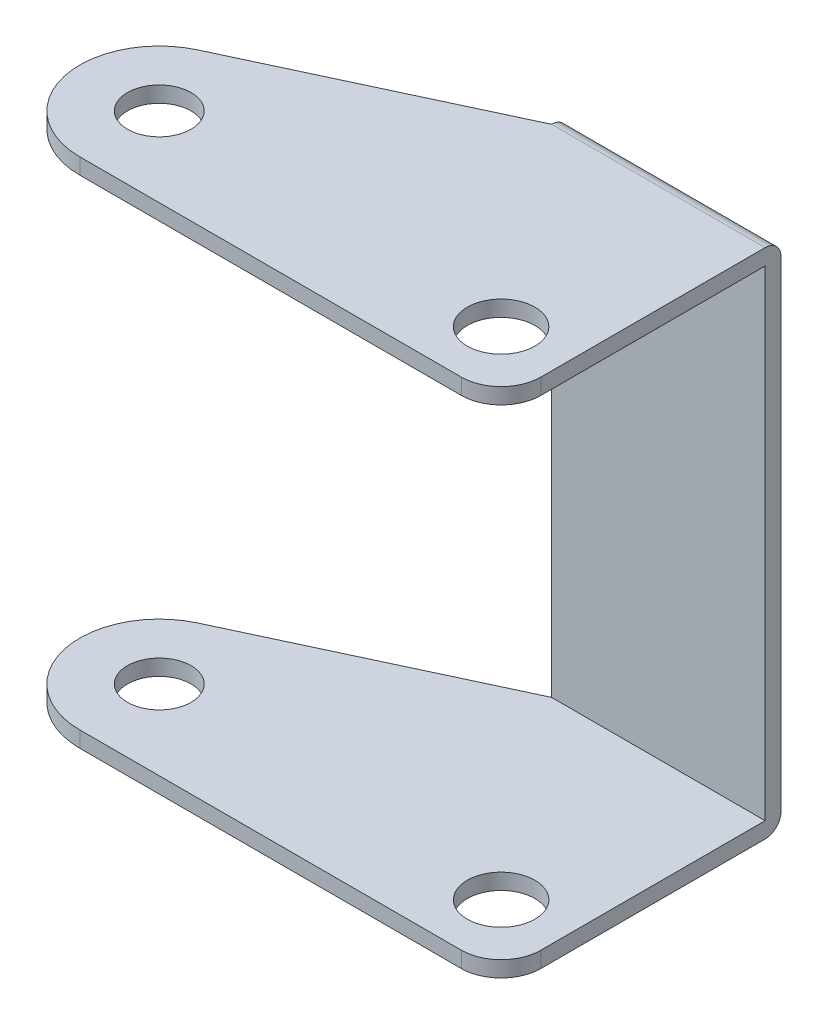
ISO-10303-21;
HEADER;
FILE_DESCRIPTION(('STEP AP214'),'2;1');
FILE_NAME('part.step','',(''),(''),'','','');
FILE_SCHEMA(('AUTOMOTIVE_DESIGN { 1 0 10303 214 1 1 1 1 }'));
ENDSEC;
DATA;
#1=APPLICATION_CONTEXT('core data for automotive mechanical design processes');
#2=APPLICATION_PROTOCOL_DEFINITION('international standard','automotive_design',2000,#1);
#3=PRODUCT_CONTEXT('',#1,'mechanical');
#4=PRODUCT('Part','Part','',(#3));
#5=PRODUCT_RELATED_PRODUCT_CATEGORY('part','',(#4));
#6=PRODUCT_DEFINITION_FORMATION('','',#4);
#7=PRODUCT_DEFINITION_CONTEXT('part definition',#1,'design');
#8=PRODUCT_DEFINITION('design','',#6,#7);
#9=PRODUCT_DEFINITION_SHAPE('','',#8);
#10=(LENGTH_UNIT() NAMED_UNIT(*) SI_UNIT(.MILLI.,.METRE.));
#11=(NAMED_UNIT(*) PLANE_ANGLE_UNIT() SI_UNIT($,.RADIAN.));
#12=(NAMED_UNIT(*) SI_UNIT($,.STERADIAN.) SOLID_ANGLE_UNIT());
#13=UNCERTAINTY_MEASURE_WITH_UNIT(LENGTH_MEASURE(1.E-05),#10,'distance_accuracy_value','');
#14=(GEOMETRIC_REPRESENTATION_CONTEXT(3) GLOBAL_UNCERTAINTY_ASSIGNED_CONTEXT((#13)) GLOBAL_UNIT_ASSIGNED_CONTEXT((#10,
#11,#12)) REPRESENTATION_CONTEXT('',''));
#15=CARTESIAN_POINT('',(0.,0.,0.));
#16=DIRECTION('',(0.,0.,1.));
#17=DIRECTION('',(1.,0.,0.));
#18=AXIS2_PLACEMENT_3D('',#15,#16,#17);
#19=CARTESIAN_POINT('',(0.,30.2146018366027,-31.7853981633975));
#20=DIRECTION('',(0.,1.,0.));
#21=DIRECTION('',(-1.,0.,0.));
#22=AXIS2_PLACEMENT_3D('',#19,#20,#21);
#23=PLANE('',#22);
#24=CARTESIAN_POINT('',(17.5,30.2146018366025,25.2146018366026));
#25=DIRECTION('',(0.,1.,0.));
#26=DIRECTION('',(0.,0.,1.));
#27=AXIS2_PLACEMENT_3D('',#24,#25,#26);
#28=CIRCLE('',#27,4.25);
#29=CARTESIAN_POINT('',(17.5,30.2146018366024,29.4646018366026));
#30=VERTEX_POINT('',#29);
#31=EDGE_CURVE('E338',#30,#30,#28,.T.);
#32=ORIENTED_EDGE('',*,*,#31,.T.);
#33=EDGE_LOOP('',(#32));
#34=FACE_BOUND('',#33,.T.);
#35=CARTESIAN_POINT('',(-27.5,30.2146018366025,23.2146018366026));
#36=DIRECTION('',(0.,1.,0.));
#37=DIRECTION('',(0.,0.,1.));
#38=AXIS2_PLACEMENT_3D('',#35,#36,#37);
#39=CIRCLE('',#38,4.);
#40=CARTESIAN_POINT('',(-27.5,30.2146018366025,27.2146018366026));
#41=VERTEX_POINT('',#40);
#42=EDGE_CURVE('E350',#41,#41,#39,.T.);
#43=ORIENTED_EDGE('',*,*,#42,.T.);
#44=EDGE_LOOP('',(#43));
#45=FACE_BOUND('',#44,.T.);
#46=DIRECTION('',(0.,0.,1.));
#47=VECTOR('',#46,1.);
#48=CARTESIAN_POINT('',(25.5,30.2146018366027,-31.7853981633975));
#49=LINE('',#48,#47);
#50=CARTESIAN_POINT('',(25.5,30.2146018366025,0.));
#51=VERTEX_POINT('',#50);
#52=CARTESIAN_POINT('',(25.5,30.2146018366025,28.2146018366026));
#53=VERTEX_POINT('',#52);
#54=EDGE_CURVE('E327',#51,#53,#49,.T.);
#55=ORIENTED_EDGE('',*,*,#54,.T.);
#56=CARTESIAN_POINT('',(20.5,30.2146018366025,28.2146018366026));
#57=DIRECTION('',(0.,1.,0.));
#58=DIRECTION('',(0.,0.,1.));
#59=AXIS2_PLACEMENT_3D('',#56,#57,#58);
#60=CIRCLE('',#59,5.);
#61=CARTESIAN_POINT('',(20.5,30.2146018366024,33.2146018366025));
#62=VERTEX_POINT('',#61);
#63=EDGE_CURVE('E12',#53,#62,#60,.F.);
#64=ORIENTED_EDGE('',*,*,#63,.T.);
#65=DIRECTION('',(-1.,0.,0.));
#66=VECTOR('',#65,1.);
#67=CARTESIAN_POINT('',(-37.5,30.2146018366024,33.2146018366025));
#68=LINE('',#67,#66);
#69=CARTESIAN_POINT('',(-27.5,30.2146018366024,33.2146018366026));
#70=VERTEX_POINT('',#69);
#71=EDGE_CURVE('E236',#62,#70,#68,.T.);
#72=ORIENTED_EDGE('',*,*,#71,.T.);
#73=CARTESIAN_POINT('',(-27.5,30.2146018366025,23.2146018366026));
#74=DIRECTION('',(0.,1.,0.));
#75=DIRECTION('',(0.,0.,1.));
#76=AXIS2_PLACEMENT_3D('',#73,#74,#75);
#77=CIRCLE('',#76,10.);
#78=CARTESIAN_POINT('',(-31.7261826174069,30.2146018366025,14.151523966236));
#79=VERTEX_POINT('',#78);
#80=EDGE_CURVE('E280',#79,#70,#77,.T.);
#81=ORIENTED_EDGE('',*,*,#80,.F.);
#82=DIRECTION('',(0.906307787036653,0.,-0.422618261740694));
#83=VECTOR('',#82,1.);
#84=CARTESIAN_POINT('',(11.9283692015548,30.2146018366026,-6.20492786026972));
#85=LINE('',#84,#83);
#86=CARTESIAN_POINT('',(-1.37814153605642,30.2146018366025,0.));
#87=VERTEX_POINT('',#86);
#88=EDGE_CURVE('E356',#79,#87,#85,.T.);
#89=ORIENTED_EDGE('',*,*,#88,.T.);
#90=DIRECTION('',(1.,0.,0.));
#91=VECTOR('',#90,1.);
#92=CARTESIAN_POINT('',(0.,30.2146018366025,0.));
#93=LINE('',#92,#91);
#94=EDGE_CURVE('E238',#87,#51,#93,.T.);
#95=ORIENTED_EDGE('',*,*,#94,.T.);
#96=EDGE_LOOP('',(#55,#64,#72,#81,#89,#95));
#97=FACE_BOUND('',#96,.T.);
#98=ADVANCED_FACE('F94',(#34,#45,#97),#23,.F.);
#99=CARTESIAN_POINT('',(0.,32.2146018366027,-31.7853981633974));
#100=DIRECTION('',(0.,1.,0.));
#101=DIRECTION('',(-1.,0.,0.));
#102=AXIS2_PLACEMENT_3D('',#99,#100,#101);
#103=PLANE('',#102);
#104=DIRECTION('',(-1.,0.,0.));
#105=VECTOR('',#104,1.);
#106=CARTESIAN_POINT('',(-37.5,32.2146018366024,33.2146018366026));
#107=LINE('',#106,#105);
#108=CARTESIAN_POINT('',(20.5,32.2146018366024,33.2146018366026));
#109=VERTEX_POINT('',#108);
#110=CARTESIAN_POINT('',(-27.5,32.2146018366024,33.2146018366026));
#111=VERTEX_POINT('',#110);
#112=EDGE_CURVE('E224',#109,#111,#107,.T.);
#113=ORIENTED_EDGE('',*,*,#112,.F.);
#114=CARTESIAN_POINT('',(20.5,32.2146018366025,28.2146018366026));
#115=DIRECTION('',(0.,1.,0.));
#116=DIRECTION('',(0.,0.,1.));
#117=AXIS2_PLACEMENT_3D('',#114,#115,#116);
#118=CIRCLE('',#117,5.);
#119=CARTESIAN_POINT('',(25.5,32.2146018366025,28.2146018366026));
#120=VERTEX_POINT('',#119);
#121=EDGE_CURVE('E102',#109,#120,#118,.T.);
#122=ORIENTED_EDGE('',*,*,#121,.T.);
#123=DIRECTION('',(0.,0.,1.));
#124=VECTOR('',#123,1.);
#125=CARTESIAN_POINT('',(25.5,32.2146018366027,-31.7853981633974));
#126=LINE('',#125,#124);
#127=CARTESIAN_POINT('',(25.5,32.2146018366025,0.));
#128=VERTEX_POINT('',#127);
#129=EDGE_CURVE('E267',#128,#120,#126,.T.);
#130=ORIENTED_EDGE('',*,*,#129,.F.);
#131=DIRECTION('',(1.,0.,0.));
#132=VECTOR('',#131,1.);
#133=CARTESIAN_POINT('',(0.,32.2146018366026,0.));
#134=LINE('',#133,#132);
#135=CARTESIAN_POINT('',(-1.37814153605642,32.2146018366025,0.));
#136=VERTEX_POINT('',#135);
#137=EDGE_CURVE('E220',#136,#128,#134,.T.);
#138=ORIENTED_EDGE('',*,*,#137,.F.);
#139=DIRECTION('',(0.906307787036653,0.,-0.422618261740694));
#140=VECTOR('',#139,1.);
#141=CARTESIAN_POINT('',(11.9283692015548,32.2146018366026,-6.20492786026971));
#142=LINE('',#141,#140);
#143=CARTESIAN_POINT('',(-31.7261826174069,32.2146018366025,14.151523966236));
#144=VERTEX_POINT('',#143);
#145=EDGE_CURVE('E355',#144,#136,#142,.T.);
#146=ORIENTED_EDGE('',*,*,#145,.F.);
#147=CARTESIAN_POINT('',(-27.5,32.2146018366025,23.2146018366026));
#148=DIRECTION('',(0.,1.,0.));
#149=DIRECTION('',(0.,0.,1.));
#150=AXIS2_PLACEMENT_3D('',#147,#148,#149);
#151=CIRCLE('',#150,10.);
#152=EDGE_CURVE('E288',#144,#111,#151,.T.);
#153=ORIENTED_EDGE('',*,*,#152,.T.);
#154=EDGE_LOOP('',(#113,#122,#130,#138,#146,#153));
#155=FACE_BOUND('',#154,.T.);
#156=CARTESIAN_POINT('',(17.5,32.2146018366025,25.2146018366026));
#157=DIRECTION('',(0.,1.,0.));
#158=DIRECTION('',(0.,0.,1.));
#159=AXIS2_PLACEMENT_3D('',#156,#157,#158);
#160=CIRCLE('',#159,4.25);
#161=CARTESIAN_POINT('',(17.5,32.2146018366024,29.4646018366026));
#162=VERTEX_POINT('',#161);
#163=EDGE_CURVE('E335',#162,#162,#160,.T.);
#164=ORIENTED_EDGE('',*,*,#163,.F.);
#165=EDGE_LOOP('',(#164));
#166=FACE_BOUND('',#165,.T.);
#167=CARTESIAN_POINT('',(-27.5,32.2146018366025,23.2146018366026));
#168=DIRECTION('',(0.,1.,0.));
#169=DIRECTION('',(0.,0.,1.));
#170=AXIS2_PLACEMENT_3D('',#167,#168,#169);
#171=CIRCLE('',#170,4.);
#172=CARTESIAN_POINT('',(-27.5,32.2146018366025,27.2146018366026));
#173=VERTEX_POINT('',#172);
#174=EDGE_CURVE('E347',#173,#173,#171,.T.);
#175=ORIENTED_EDGE('',*,*,#174,.F.);
#176=EDGE_LOOP('',(#175));
#177=FACE_BOUND('',#176,.T.);
#178=ADVANCED_FACE('F264',(#155,#166,#177),#103,.T.);
#179=CARTESIAN_POINT('',(0.,0.,0.));
#180=DIRECTION('',(0.,0.,-1.));
#181=DIRECTION('',(-1.,0.,0.));
#182=AXIS2_PLACEMENT_3D('',#179,#180,#181);
#183=PLANE('',#182);
#184=DIRECTION('',(1.,0.,0.));
#185=VECTOR('',#184,1.);
#186=CARTESIAN_POINT('',(0.,-30.2146018366025,0.));
#187=LINE('',#186,#185);
#188=CARTESIAN_POINT('',(-1.37814153605642,-30.2146018366025,-2.04092611816018E-13));
#189=VERTEX_POINT('',#188);
#190=CARTESIAN_POINT('',(25.5,-30.2146018366025,0.));
#191=VERTEX_POINT('',#190);
#192=EDGE_CURVE('E245',#189,#191,#187,.T.);
#193=ORIENTED_EDGE('',*,*,#192,.T.);
#194=DIRECTION('',(0.,1.,0.));
#195=VECTOR('',#194,1.);
#196=CARTESIAN_POINT('',(25.5,0.,0.));
#197=LINE('',#196,#195);
#198=EDGE_CURVE('E324',#191,#51,#197,.T.);
#199=ORIENTED_EDGE('',*,*,#198,.T.);
#200=ORIENTED_EDGE('',*,*,#94,.F.);
#201=DIRECTION('',(0.,1.,0.));
#202=VECTOR('',#201,1.);
#203=CARTESIAN_POINT('',(-1.37814153605642,-32.2146018366026,-2.11075574493705E-13));
#204=LINE('',#203,#202);
#205=EDGE_CURVE('E365',#189,#87,#204,.T.);
#206=ORIENTED_EDGE('',*,*,#205,.F.);
#207=EDGE_LOOP('',(#193,#199,#200,#206));
#208=FACE_BOUND('',#207,.T.);
#209=ADVANCED_FACE('F398',(#208),#183,.F.);
#210=CARTESIAN_POINT('',(0.,0.,-2.));
#211=DIRECTION('',(0.,0.,-1.));
#212=DIRECTION('',(-1.,0.,0.));
#213=AXIS2_PLACEMENT_3D('',#210,#211,#212);
#214=PLANE('',#213);
#215=DIRECTION('',(0.,1.,0.));
#216=VECTOR('',#215,1.);
#217=CARTESIAN_POINT('',(25.5,0.,-2.));
#218=LINE('',#217,#216);
#219=CARTESIAN_POINT('',(25.5,-30.2146018366025,-2.));
#220=VERTEX_POINT('',#219);
#221=CARTESIAN_POINT('',(25.5,30.2146018366025,-2.));
#222=VERTEX_POINT('',#221);
#223=EDGE_CURVE('E213',#220,#222,#218,.T.);
#224=ORIENTED_EDGE('',*,*,#223,.F.);
#225=DIRECTION('',(1.,0.,0.));
#226=VECTOR('',#225,1.);
#227=CARTESIAN_POINT('',(0.,-30.2146018366025,-2.));
#228=LINE('',#227,#226);
#229=CARTESIAN_POINT('',(-1.37814153605643,-30.2146018366025,-2.00000000000023));
#230=VERTEX_POINT('',#229);
#231=EDGE_CURVE('E212',#230,#220,#228,.T.);
#232=ORIENTED_EDGE('',*,*,#231,.F.);
#233=DIRECTION('',(0.,1.,0.));
#234=VECTOR('',#233,1.);
#235=CARTESIAN_POINT('',(-1.37814153605642,0.,-2.));
#236=LINE('',#235,#234);
#237=CARTESIAN_POINT('',(-1.37814153605642,30.2146018366025,-2.));
#238=VERTEX_POINT('',#237);
#239=EDGE_CURVE('E318',#230,#238,#236,.T.);
#240=ORIENTED_EDGE('',*,*,#239,.T.);
#241=DIRECTION('',(1.,0.,0.));
#242=VECTOR('',#241,1.);
#243=CARTESIAN_POINT('',(0.,30.2146018366026,-2.));
#244=LINE('',#243,#242);
#245=EDGE_CURVE('E242',#238,#222,#244,.T.);
#246=ORIENTED_EDGE('',*,*,#245,.T.);
#247=EDGE_LOOP('',(#224,#232,#240,#246));
#248=FACE_BOUND('',#247,.T.);
#249=ADVANCED_FACE('F317',(#248),#214,.T.);
#250=CARTESIAN_POINT('',(-37.5,30.2146018366025,0.));
#251=DIRECTION('',(-1.,0.,0.));
#252=DIRECTION('',(0.,0.,1.));
#253=AXIS2_PLACEMENT_3D('',#250,#251,#252);
#254=CYLINDRICAL_SURFACE('',#253,2.);
#255=CARTESIAN_POINT('',(25.5,30.2146018366025,0.));
#256=DIRECTION('',(-1.,0.,0.));
#257=DIRECTION('',(0.,0.,1.));
#258=AXIS2_PLACEMENT_3D('',#255,#256,#257);
#259=CIRCLE('',#258,2.);
#260=EDGE_CURVE('E270',#222,#128,#259,.F.);
#261=ORIENTED_EDGE('',*,*,#260,.F.);
#262=ORIENTED_EDGE('',*,*,#245,.F.);
#263=CARTESIAN_POINT('',(-1.37814153605642,30.2146018366025,0.));
#264=DIRECTION('',(-1.,0.,0.));
#265=DIRECTION('',(0.,-1.,0.));
#266=AXIS2_PLACEMENT_3D('',#263,#264,#265);
#267=CIRCLE('',#266,2.00000000000001);
#268=EDGE_CURVE('E364',#136,#238,#267,.T.);
#269=ORIENTED_EDGE('',*,*,#268,.F.);
#270=ORIENTED_EDGE('',*,*,#137,.T.);
#271=EDGE_LOOP('',(#261,#262,#269,#270));
#272=FACE_BOUND('',#271,.T.);
#273=ADVANCED_FACE('F403',(#272),#254,.T.);
#274=CARTESIAN_POINT('',(0.,-30.2146018366027,-31.7853981633974));
#275=DIRECTION('',(0.,-1.,0.));
#276=DIRECTION('',(-1.,0.,0.));
#277=AXIS2_PLACEMENT_3D('',#274,#275,#276);
#278=PLANE('',#277);
#279=CARTESIAN_POINT('',(17.5,-30.2146018366025,25.2146018366023));
#280=DIRECTION('',(0.,-1.,0.));
#281=DIRECTION('',(0.,0.,-1.));
#282=AXIS2_PLACEMENT_3D('',#279,#280,#281);
#283=CIRCLE('',#282,4.25);
#284=CARTESIAN_POINT('',(17.5,-30.2146018366025,20.9646018366023));
#285=VERTEX_POINT('',#284);
#286=EDGE_CURVE('E332',#285,#285,#283,.T.);
#287=ORIENTED_EDGE('',*,*,#286,.T.);
#288=EDGE_LOOP('',(#287));
#289=FACE_BOUND('',#288,.T.);
#290=CARTESIAN_POINT('',(-27.5,-30.2146018366025,23.2146018366024));
#291=DIRECTION('',(0.,-1.,0.));
#292=DIRECTION('',(0.,0.,-1.));
#293=AXIS2_PLACEMENT_3D('',#290,#291,#292);
#294=CIRCLE('',#293,4.);
#295=CARTESIAN_POINT('',(-27.5,-30.2146018366025,19.2146018366023));
#296=VERTEX_POINT('',#295);
#297=EDGE_CURVE('E344',#296,#296,#294,.T.);
#298=ORIENTED_EDGE('',*,*,#297,.T.);
#299=EDGE_LOOP('',(#298));
#300=FACE_BOUND('',#299,.T.);
#301=DIRECTION('',(1.,0.,0.));
#302=VECTOR('',#301,1.);
#303=CARTESIAN_POINT('',(-37.5,-30.2146018366024,33.2146018366026));
#304=LINE('',#303,#302);
#305=CARTESIAN_POINT('',(-27.5,-30.2146018366024,33.2146018366023));
#306=VERTEX_POINT('',#305);
#307=CARTESIAN_POINT('',(20.5,-30.2146018366024,33.2146018366026));
#308=VERTEX_POINT('',#307);
#309=EDGE_CURVE('E221',#306,#308,#304,.T.);
#310=ORIENTED_EDGE('',*,*,#309,.T.);
#311=CARTESIAN_POINT('',(20.5,-30.2146018366024,28.2146018366026));
#312=DIRECTION('',(0.,-1.,0.));
#313=DIRECTION('',(0.,0.,-1.));
#314=AXIS2_PLACEMENT_3D('',#311,#312,#313);
#315=CIRCLE('',#314,5.);
#316=CARTESIAN_POINT('',(25.5,-30.2146018366024,28.2146018366026));
#317=VERTEX_POINT('',#316);
#318=EDGE_CURVE('E252',#308,#317,#315,.F.);
#319=ORIENTED_EDGE('',*,*,#318,.T.);
#320=DIRECTION('',(0.,0.,-1.));
#321=VECTOR('',#320,1.);
#322=CARTESIAN_POINT('',(25.5,-30.2146018366027,-31.7853981633974));
#323=LINE('',#322,#321);
#324=EDGE_CURVE('E271',#317,#191,#323,.T.);
#325=ORIENTED_EDGE('',*,*,#324,.T.);
#326=ORIENTED_EDGE('',*,*,#192,.F.);
#327=DIRECTION('',(-0.906307787036653,0.,0.422618261740694));
#328=VECTOR('',#327,1.);
#329=CARTESIAN_POINT('',(11.9283692015547,-30.2146018366026,-6.20492786026989));
#330=LINE('',#329,#328);
#331=CARTESIAN_POINT('',(-31.7261826174069,-30.2146018366025,14.1515239662358));
#332=VERTEX_POINT('',#331);
#333=EDGE_CURVE('E291',#189,#332,#330,.T.);
#334=ORIENTED_EDGE('',*,*,#333,.T.);
#335=CARTESIAN_POINT('',(-27.5,-30.2146018366025,23.2146018366024));
#336=DIRECTION('',(0.,-1.,0.));
#337=DIRECTION('',(0.,0.,-1.));
#338=AXIS2_PLACEMENT_3D('',#335,#336,#337);
#339=CIRCLE('',#338,10.);
#340=EDGE_CURVE('E299',#306,#332,#339,.T.);
#341=ORIENTED_EDGE('',*,*,#340,.F.);
#342=EDGE_LOOP('',(#310,#319,#325,#326,#334,#341));
#343=FACE_BOUND('',#342,.T.);
#344=ADVANCED_FACE('F381',(#289,#300,#343),#278,.F.);
#345=CARTESIAN_POINT('',(0.,-32.2146018366027,-31.7853981633974));
#346=DIRECTION('',(0.,-1.,0.));
#347=DIRECTION('',(-1.,0.,0.));
#348=AXIS2_PLACEMENT_3D('',#345,#346,#347);
#349=PLANE('',#348);
#350=DIRECTION('',(0.,0.,1.));
#351=VECTOR('',#350,1.);
#352=CARTESIAN_POINT('',(25.5,-32.2146018366028,33.2146018366023));
#353=LINE('',#352,#351);
#354=CARTESIAN_POINT('',(25.5,-32.2146018366027,0.));
#355=VERTEX_POINT('',#354);
#356=CARTESIAN_POINT('',(25.5,-32.2146018366027,28.2146018366026));
#357=VERTEX_POINT('',#356);
#358=EDGE_CURVE('E193',#355,#357,#353,.T.);
#359=ORIENTED_EDGE('',*,*,#358,.T.);
#360=CARTESIAN_POINT('',(20.5,-32.2146018366024,28.2146018366026));
#361=DIRECTION('',(0.,-1.,0.));
#362=DIRECTION('',(0.,0.,-1.));
#363=AXIS2_PLACEMENT_3D('',#360,#361,#362);
#364=CIRCLE('',#363,5.);
#365=CARTESIAN_POINT('',(20.5,-32.2146018366024,33.2146018366026));
#366=VERTEX_POINT('',#365);
#367=EDGE_CURVE('E257',#357,#366,#364,.T.);
#368=ORIENTED_EDGE('',*,*,#367,.T.);
#369=DIRECTION('',(1.,0.,0.));
#370=VECTOR('',#369,1.);
#371=CARTESIAN_POINT('',(-37.5,-32.2146018366024,33.2146018366026));
#372=LINE('',#371,#370);
#373=CARTESIAN_POINT('',(-27.5,-32.2146018366024,33.2146018366023));
#374=VERTEX_POINT('',#373);
#375=EDGE_CURVE('E227',#374,#366,#372,.T.);
#376=ORIENTED_EDGE('',*,*,#375,.F.);
#377=CARTESIAN_POINT('',(-27.5,-32.2146018366025,23.2146018366024));
#378=DIRECTION('',(0.,-1.,0.));
#379=DIRECTION('',(0.,0.,-1.));
#380=AXIS2_PLACEMENT_3D('',#377,#378,#379);
#381=CIRCLE('',#380,10.);
#382=CARTESIAN_POINT('',(-31.7261826174069,-32.2146018366025,14.1515239662358));
#383=VERTEX_POINT('',#382);
#384=EDGE_CURVE('E298',#374,#383,#381,.T.);
#385=ORIENTED_EDGE('',*,*,#384,.T.);
#386=DIRECTION('',(-0.906307787036653,0.,0.422618261740694));
#387=VECTOR('',#386,1.);
#388=CARTESIAN_POINT('',(11.9283692015547,-32.2146018366026,-6.20492786026988));
#389=LINE('',#388,#387);
#390=CARTESIAN_POINT('',(-1.37814153605642,-32.2146018366025,0.));
#391=VERTEX_POINT('',#390);
#392=EDGE_CURVE('E219',#391,#383,#389,.T.);
#393=ORIENTED_EDGE('',*,*,#392,.F.);
#394=DIRECTION('',(1.,0.,0.));
#395=VECTOR('',#394,1.);
#396=CARTESIAN_POINT('',(0.,-32.2146018366025,0.));
#397=LINE('',#396,#395);
#398=EDGE_CURVE('E210',#391,#355,#397,.T.);
#399=ORIENTED_EDGE('',*,*,#398,.T.);
#400=EDGE_LOOP('',(#359,#368,#376,#385,#393,#399));
#401=FACE_BOUND('',#400,.T.);
#402=CARTESIAN_POINT('',(17.5,-32.2146018366027,25.2146018366023));
#403=DIRECTION('',(0.,1.,0.));
#404=DIRECTION('',(0.,0.,1.));
#405=AXIS2_PLACEMENT_3D('',#402,#403,#404);
#406=CIRCLE('',#405,4.25);
#407=CARTESIAN_POINT('',(17.5,-32.2146018366028,29.4646018366023));
#408=VERTEX_POINT('',#407);
#409=EDGE_CURVE('E329',#408,#408,#406,.T.);
#410=ORIENTED_EDGE('',*,*,#409,.T.);
#411=EDGE_LOOP('',(#410));
#412=FACE_BOUND('',#411,.T.);
#413=CARTESIAN_POINT('',(-27.5,-32.2146018366026,23.2146018366023));
#414=DIRECTION('',(0.,1.,0.));
#415=DIRECTION('',(0.,0.,1.));
#416=AXIS2_PLACEMENT_3D('',#413,#414,#415);
#417=CIRCLE('',#416,4.);
#418=CARTESIAN_POINT('',(-27.5,-32.2146018366027,27.2146018366023));
#419=VERTEX_POINT('',#418);
#420=EDGE_CURVE('E341',#419,#419,#417,.T.);
#421=ORIENTED_EDGE('',*,*,#420,.T.);
#422=EDGE_LOOP('',(#421));
#423=FACE_BOUND('',#422,.T.);
#424=ADVANCED_FACE('F216',(#401,#412,#423),#349,.T.);
#425=CARTESIAN_POINT('',(-37.5,-32.2146018366024,33.2146018366026));
#426=DIRECTION('',(0.,0.,1.));
#427=DIRECTION('',(0.,-1.,0.));
#428=AXIS2_PLACEMENT_3D('',#425,#426,#427);
#429=PLANE('',#428);
#430=ORIENTED_EDGE('',*,*,#375,.T.);
#431=DIRECTION('',(0.,1.,0.));
#432=VECTOR('',#431,1.);
#433=CARTESIAN_POINT('',(20.5,-30.2146018366024,33.2146018366026));
#434=LINE('',#433,#432);
#435=EDGE_CURVE('E249',#366,#308,#434,.T.);
#436=ORIENTED_EDGE('',*,*,#435,.T.);
#437=ORIENTED_EDGE('',*,*,#309,.F.);
#438=DIRECTION('',(0.,1.,0.));
#439=VECTOR('',#438,1.);
#440=CARTESIAN_POINT('',(-27.5,-30.2146018366024,33.2146018366023));
#441=LINE('',#440,#439);
#442=EDGE_CURVE('E370',#306,#374,#441,.F.);
#443=ORIENTED_EDGE('',*,*,#442,.T.);
#444=EDGE_LOOP('',(#430,#436,#437,#443));
#445=FACE_BOUND('',#444,.T.);
#446=ADVANCED_FACE('F376',(#445),#429,.T.);
#447=CARTESIAN_POINT('',(37.5,-30.2146018366025,0.));
#448=DIRECTION('',(1.,0.,0.));
#449=DIRECTION('',(0.,0.,-1.));
#450=AXIS2_PLACEMENT_3D('',#447,#448,#449);
#451=CYLINDRICAL_SURFACE('',#450,2.);
#452=ORIENTED_EDGE('',*,*,#231,.T.);
#453=CARTESIAN_POINT('',(25.5,-30.2146018366025,0.));
#454=DIRECTION('',(-1.,0.,0.));
#455=DIRECTION('',(0.,0.,1.));
#456=AXIS2_PLACEMENT_3D('',#453,#454,#455);
#457=CIRCLE('',#456,2.);
#458=EDGE_CURVE('E197',#220,#355,#457,.T.);
#459=ORIENTED_EDGE('',*,*,#458,.T.);
#460=ORIENTED_EDGE('',*,*,#398,.F.);
#461=CARTESIAN_POINT('',(-1.37814153605641,-30.2146018366025,-2.04092611816018E-13));
#462=DIRECTION('',(-1.,0.,0.));
#463=DIRECTION('',(0.,0.,1.));
#464=AXIS2_PLACEMENT_3D('',#461,#462,#463);
#465=CIRCLE('',#464,2.00000000000003);
#466=EDGE_CURVE('E287',#230,#391,#465,.T.);
#467=ORIENTED_EDGE('',*,*,#466,.F.);
#468=EDGE_LOOP('',(#452,#459,#460,#467));
#469=FACE_BOUND('',#468,.T.);
#470=ADVANCED_FACE('F208',(#469),#451,.T.);
#471=CARTESIAN_POINT('',(-37.5,32.2146018366024,33.2146018366026));
#472=DIRECTION('',(0.,0.,1.));
#473=DIRECTION('',(0.,-1.,0.));
#474=AXIS2_PLACEMENT_3D('',#471,#472,#473);
#475=PLANE('',#474);
#476=ORIENTED_EDGE('',*,*,#71,.F.);
#477=DIRECTION('',(0.,1.,0.));
#478=VECTOR('',#477,1.);
#479=CARTESIAN_POINT('',(20.5,32.2146018366024,33.2146018366026));
#480=LINE('',#479,#478);
#481=EDGE_CURVE('E259',#62,#109,#480,.T.);
#482=ORIENTED_EDGE('',*,*,#481,.T.);
#483=ORIENTED_EDGE('',*,*,#112,.T.);
#484=DIRECTION('',(0.,-1.,0.));
#485=VECTOR('',#484,1.);
#486=CARTESIAN_POINT('',(-27.5,30.2146018366024,33.2146018366026));
#487=LINE('',#486,#485);
#488=EDGE_CURVE('E277',#70,#111,#487,.F.);
#489=ORIENTED_EDGE('',*,*,#488,.F.);
#490=EDGE_LOOP('',(#476,#482,#483,#489));
#491=FACE_BOUND('',#490,.T.);
#492=ADVANCED_FACE('F274',(#491),#475,.T.);
#493=CARTESIAN_POINT('',(-27.5,-30.2146018366025,23.2146018366024));
#494=DIRECTION('',(0.,-1.,0.));
#495=DIRECTION('',(0.,0.,-1.));
#496=AXIS2_PLACEMENT_3D('',#493,#494,#495);
#497=CYLINDRICAL_SURFACE('',#496,10.);
#498=ORIENTED_EDGE('',*,*,#384,.F.);
#499=ORIENTED_EDGE('',*,*,#442,.F.);
#500=ORIENTED_EDGE('',*,*,#340,.T.);
#501=DIRECTION('',(0.,1.,0.));
#502=VECTOR('',#501,1.);
#503=CARTESIAN_POINT('',(-31.7261826174069,-30.2146018366025,14.1515239662358));
#504=LINE('',#503,#502);
#505=EDGE_CURVE('E235',#332,#383,#504,.F.);
#506=ORIENTED_EDGE('',*,*,#505,.T.);
#507=EDGE_LOOP('',(#498,#499,#500,#506));
#508=FACE_BOUND('',#507,.T.);
#509=ADVANCED_FACE('F382',(#508),#497,.T.);
#510=CARTESIAN_POINT('',(11.9283692015547,-30.2146018366026,-6.20492786026989));
#511=DIRECTION('',(0.422618261740694,0.,0.906307787036653));
#512=DIRECTION('',(-0.906307787036653,0.,0.422618261740694));
#513=AXIS2_PLACEMENT_3D('',#510,#511,#512);
#514=PLANE('',#513);
#515=ORIENTED_EDGE('',*,*,#505,.F.);
#516=ORIENTED_EDGE('',*,*,#333,.F.);
#517=DIRECTION('',(0.,1.,0.));
#518=VECTOR('',#517,1.);
#519=CARTESIAN_POINT('',(-1.37814153605642,-30.2146018366025,-2.04092611816018E-13));
#520=LINE('',#519,#518);
#521=EDGE_CURVE('E230',#189,#391,#520,.F.);
#522=ORIENTED_EDGE('',*,*,#521,.T.);
#523=ORIENTED_EDGE('',*,*,#392,.T.);
#524=EDGE_LOOP('',(#515,#516,#522,#523));
#525=FACE_BOUND('',#524,.T.);
#526=ADVANCED_FACE('F309',(#525),#514,.F.);
#527=CARTESIAN_POINT('',(-1.37814153605642,-30.2146018366025,-2.0122792321331E-13));
#528=DIRECTION('',(-1.,0.,0.));
#529=DIRECTION('',(0.,0.,1.));
#530=AXIS2_PLACEMENT_3D('',#527,#528,#529);
#531=PLANE('',#530);
#532=ORIENTED_EDGE('',*,*,#466,.T.);
#533=ORIENTED_EDGE('',*,*,#521,.F.);
#534=DIRECTION('',(0.,0.,1.));
#535=VECTOR('',#534,1.);
#536=CARTESIAN_POINT('',(-1.37814153605642,-30.2146018366025,-2.04092611816018E-13));
#537=LINE('',#536,#535);
#538=EDGE_CURVE('E314',#189,#230,#537,.F.);
#539=ORIENTED_EDGE('',*,*,#538,.T.);
#540=EDGE_LOOP('',(#532,#533,#539));
#541=FACE_BOUND('',#540,.T.);
#542=ADVANCED_FACE('F313',(#541),#531,.T.);
#543=CARTESIAN_POINT('',(-27.5,30.2146018366025,23.2146018366026));
#544=DIRECTION('',(0.,1.,0.));
#545=DIRECTION('',(0.,0.,1.));
#546=AXIS2_PLACEMENT_3D('',#543,#544,#545);
#547=CYLINDRICAL_SURFACE('',#546,10.);
#548=ORIENTED_EDGE('',*,*,#80,.T.);
#549=ORIENTED_EDGE('',*,*,#488,.T.);
#550=ORIENTED_EDGE('',*,*,#152,.F.);
#551=DIRECTION('',(0.,-1.,0.));
#552=VECTOR('',#551,1.);
#553=CARTESIAN_POINT('',(-31.7261826174069,30.2146018366025,14.151523966236));
#554=LINE('',#553,#552);
#555=EDGE_CURVE('E286',#79,#144,#554,.F.);
#556=ORIENTED_EDGE('',*,*,#555,.F.);
#557=EDGE_LOOP('',(#548,#549,#550,#556));
#558=FACE_BOUND('',#557,.T.);
#559=ADVANCED_FACE('F284',(#558),#547,.T.);
#560=CARTESIAN_POINT('',(-1.37814153605642,-32.2146018366026,-2.11075574493705E-13));
#561=DIRECTION('',(-1.,0.,0.));
#562=DIRECTION('',(0.,1.,0.));
#563=AXIS2_PLACEMENT_3D('',#560,#561,#562);
#564=PLANE('',#563);
#565=ORIENTED_EDGE('',*,*,#538,.F.);
#566=ORIENTED_EDGE('',*,*,#205,.T.);
#567=DIRECTION('',(0.,0.,1.));
#568=VECTOR('',#567,1.);
#569=CARTESIAN_POINT('',(-1.37814153605642,30.2146018366025,0.));
#570=LINE('',#569,#568);
#571=EDGE_CURVE('E361',#87,#238,#570,.F.);
#572=ORIENTED_EDGE('',*,*,#571,.T.);
#573=ORIENTED_EDGE('',*,*,#239,.F.);
#574=EDGE_LOOP('',(#565,#566,#572,#573));
#575=FACE_BOUND('',#574,.T.);
#576=ADVANCED_FACE('F435',(#575),#564,.T.);
#577=CARTESIAN_POINT('',(-1.37814153605642,30.2146018366025,0.));
#578=DIRECTION('',(-1.,0.,0.));
#579=DIRECTION('',(0.,-1.,0.));
#580=AXIS2_PLACEMENT_3D('',#577,#578,#579);
#581=PLANE('',#580);
#582=ORIENTED_EDGE('',*,*,#268,.T.);
#583=ORIENTED_EDGE('',*,*,#571,.F.);
#584=DIRECTION('',(0.,-1.,0.));
#585=VECTOR('',#584,1.);
#586=CARTESIAN_POINT('',(-1.37814153605642,30.2146018366025,0.));
#587=LINE('',#586,#585);
#588=EDGE_CURVE('E353',#87,#136,#587,.F.);
#589=ORIENTED_EDGE('',*,*,#588,.T.);
#590=EDGE_LOOP('',(#582,#583,#589));
#591=FACE_BOUND('',#590,.T.);
#592=ADVANCED_FACE('F433',(#591),#581,.T.);
#593=CARTESIAN_POINT('',(11.9283692015548,30.2146018366026,-6.20492786026972));
#594=DIRECTION('',(0.422618261740694,0.,0.906307787036653));
#595=DIRECTION('',(0.906307787036653,0.,-0.422618261740694));
#596=AXIS2_PLACEMENT_3D('',#593,#594,#595);
#597=PLANE('',#596);
#598=ORIENTED_EDGE('',*,*,#588,.F.);
#599=ORIENTED_EDGE('',*,*,#88,.F.);
#600=ORIENTED_EDGE('',*,*,#555,.T.);
#601=ORIENTED_EDGE('',*,*,#145,.T.);
#602=EDGE_LOOP('',(#598,#599,#600,#601));
#603=FACE_BOUND('',#602,.T.);
#604=ADVANCED_FACE('F430',(#603),#597,.F.);
#605=CARTESIAN_POINT('',(-27.5,-32.2146018366026,23.2146018366023));
#606=DIRECTION('',(0.,1.,0.));
#607=DIRECTION('',(0.,0.,1.));
#608=AXIS2_PLACEMENT_3D('',#605,#606,#607);
#609=CYLINDRICAL_SURFACE('',#608,4.);
#610=ORIENTED_EDGE('',*,*,#420,.F.);
#611=EDGE_LOOP('',(#610));
#612=FACE_BOUND('',#611,.T.);
#613=ORIENTED_EDGE('',*,*,#297,.F.);
#614=EDGE_LOOP('',(#613));
#615=FACE_BOUND('',#614,.T.);
#616=ADVANCED_FACE('F428',(#612,#615),#609,.F.);
#617=ORIENTED_EDGE('',*,*,#174,.T.);
#618=EDGE_LOOP('',(#617));
#619=FACE_BOUND('',#618,.T.);
#620=ORIENTED_EDGE('',*,*,#42,.F.);
#621=EDGE_LOOP('',(#620));
#622=FACE_BOUND('',#621,.T.);
#623=ADVANCED_FACE('F425',(#619,#622),#609,.F.);
#624=CARTESIAN_POINT('',(17.5,-32.2146018366027,25.2146018366023));
#625=DIRECTION('',(0.,1.,0.));
#626=DIRECTION('',(0.,0.,1.));
#627=AXIS2_PLACEMENT_3D('',#624,#625,#626);
#628=CYLINDRICAL_SURFACE('',#627,4.25);
#629=ORIENTED_EDGE('',*,*,#409,.F.);
#630=EDGE_LOOP('',(#629));
#631=FACE_BOUND('',#630,.T.);
#632=ORIENTED_EDGE('',*,*,#286,.F.);
#633=EDGE_LOOP('',(#632));
#634=FACE_BOUND('',#633,.T.);
#635=ADVANCED_FACE('F421',(#631,#634),#628,.F.);
#636=ORIENTED_EDGE('',*,*,#163,.T.);
#637=EDGE_LOOP('',(#636));
#638=FACE_BOUND('',#637,.T.);
#639=ORIENTED_EDGE('',*,*,#31,.F.);
#640=EDGE_LOOP('',(#639));
#641=FACE_BOUND('',#640,.T.);
#642=ADVANCED_FACE('F416',(#638,#641),#628,.F.);
#643=CARTESIAN_POINT('',(25.5,-32.2146018366028,33.2146018366023));
#644=DIRECTION('',(-1.,0.,0.));
#645=DIRECTION('',(0.,0.,1.));
#646=AXIS2_PLACEMENT_3D('',#643,#644,#645);
#647=PLANE('',#646);
#648=ORIENTED_EDGE('',*,*,#324,.F.);
#649=DIRECTION('',(0.,1.,0.));
#650=VECTOR('',#649,1.);
#651=CARTESIAN_POINT('',(25.5,-32.2146018366028,28.2146018366026));
#652=LINE('',#651,#650);
#653=EDGE_CURVE('E200',#317,#357,#652,.F.);
#654=ORIENTED_EDGE('',*,*,#653,.T.);
#655=ORIENTED_EDGE('',*,*,#358,.F.);
#656=ORIENTED_EDGE('',*,*,#458,.F.);
#657=ORIENTED_EDGE('',*,*,#223,.T.);
#658=ORIENTED_EDGE('',*,*,#260,.T.);
#659=ORIENTED_EDGE('',*,*,#129,.T.);
#660=DIRECTION('',(0.,1.,0.));
#661=VECTOR('',#660,1.);
#662=CARTESIAN_POINT('',(25.5,30.2146018366025,28.2146018366026));
#663=LINE('',#662,#661);
#664=EDGE_CURVE('E254',#120,#53,#663,.F.);
#665=ORIENTED_EDGE('',*,*,#664,.T.);
#666=ORIENTED_EDGE('',*,*,#54,.F.);
#667=ORIENTED_EDGE('',*,*,#198,.F.);
#668=EDGE_LOOP('',(#648,#654,#655,#656,#657,#658,#659,#665,#666,#667));
#669=FACE_BOUND('',#668,.T.);
#670=ADVANCED_FACE('F196',(#669),#647,.F.);
#671=CARTESIAN_POINT('',(20.5,-32.2146018366024,28.2146018366026));
#672=DIRECTION('',(0.,-1.,0.));
#673=DIRECTION('',(0.,0.,-1.));
#674=AXIS2_PLACEMENT_3D('',#671,#672,#673);
#675=CYLINDRICAL_SURFACE('',#674,5.);
#676=ORIENTED_EDGE('',*,*,#367,.F.);
#677=ORIENTED_EDGE('',*,*,#653,.F.);
#678=ORIENTED_EDGE('',*,*,#318,.F.);
#679=ORIENTED_EDGE('',*,*,#435,.F.);
#680=EDGE_LOOP('',(#676,#677,#678,#679));
#681=FACE_BOUND('',#680,.T.);
#682=ADVANCED_FACE('F379',(#681),#675,.T.);
#683=CARTESIAN_POINT('',(20.5,32.2146018366025,28.2146018366026));
#684=DIRECTION('',(0.,-1.,0.));
#685=DIRECTION('',(0.,0.,-1.));
#686=AXIS2_PLACEMENT_3D('',#683,#684,#685);
#687=CYLINDRICAL_SURFACE('',#686,5.);
#688=ORIENTED_EDGE('',*,*,#63,.F.);
#689=ORIENTED_EDGE('',*,*,#664,.F.);
#690=ORIENTED_EDGE('',*,*,#121,.F.);
#691=ORIENTED_EDGE('',*,*,#481,.F.);
#692=EDGE_LOOP('',(#688,#689,#690,#691));
#693=FACE_BOUND('',#692,.T.);
#694=ADVANCED_FACE('F96',(#693),#687,.T.);
#695=CLOSED_SHELL('',(#98,#178,#209,#249,#273,#344,#424,#446,#470,#492,#509,#526,#542,#559,#576,
#592,#604,#616,#623,#635,#642,#670,#682,#694));
#696=MANIFOLD_SOLID_BREP('B2',#695);
#697=ADVANCED_BREP_SHAPE_REPRESENTATION('',(#18,#696),#14);
#698=SHAPE_DEFINITION_REPRESENTATION(#9,#697);
ENDSEC;
END-ISO-10303-21;
